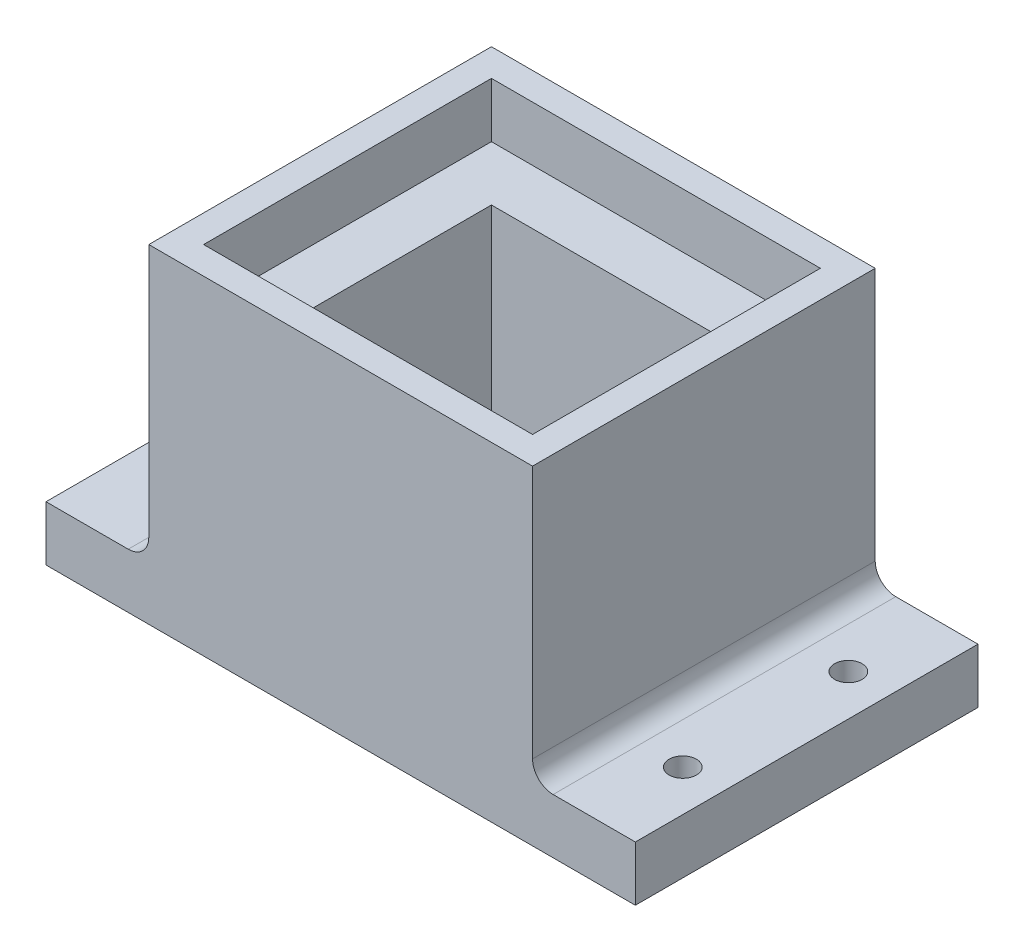
ISO-10303-21;
HEADER;
FILE_DESCRIPTION(('STEP AP214'),'2;1');
FILE_NAME('part.step','',(''),(''),'','','');
FILE_SCHEMA(('AUTOMOTIVE_DESIGN { 1 0 10303 214 1 1 1 1 }'));
ENDSEC;
DATA;
#1=APPLICATION_CONTEXT('core data for automotive mechanical design processes');
#2=APPLICATION_PROTOCOL_DEFINITION('international standard','automotive_design',2000,#1);
#3=PRODUCT_CONTEXT('',#1,'mechanical');
#4=PRODUCT('Part','Part','',(#3));
#5=PRODUCT_RELATED_PRODUCT_CATEGORY('part','',(#4));
#6=PRODUCT_DEFINITION_FORMATION('','',#4);
#7=PRODUCT_DEFINITION_CONTEXT('part definition',#1,'design');
#8=PRODUCT_DEFINITION('design','',#6,#7);
#9=PRODUCT_DEFINITION_SHAPE('','',#8);
#10=(LENGTH_UNIT() NAMED_UNIT(*) SI_UNIT(.MILLI.,.METRE.));
#11=(NAMED_UNIT(*) PLANE_ANGLE_UNIT() SI_UNIT($,.RADIAN.));
#12=(NAMED_UNIT(*) SI_UNIT($,.STERADIAN.) SOLID_ANGLE_UNIT());
#13=UNCERTAINTY_MEASURE_WITH_UNIT(LENGTH_MEASURE(1.E-05),#10,'distance_accuracy_value','');
#14=(GEOMETRIC_REPRESENTATION_CONTEXT(3) GLOBAL_UNCERTAINTY_ASSIGNED_CONTEXT((#13)) GLOBAL_UNIT_ASSIGNED_CONTEXT((#10,
#11,#12)) REPRESENTATION_CONTEXT('',''));
#15=CARTESIAN_POINT('',(0.,0.,0.));
#16=DIRECTION('',(0.,0.,1.));
#17=DIRECTION('',(1.,0.,0.));
#18=AXIS2_PLACEMENT_3D('',#15,#16,#17);
#19=CARTESIAN_POINT('',(28.,48.,25.));
#20=DIRECTION('',(-1.,0.,0.));
#21=DIRECTION('',(0.,0.,1.));
#22=AXIS2_PLACEMENT_3D('',#19,#20,#21);
#23=PLANE('',#22);
#24=DIRECTION('',(0.,-1.,0.));
#25=VECTOR('',#24,1.);
#26=CARTESIAN_POINT('',(28.,48.,25.));
#27=LINE('',#26,#25);
#28=CARTESIAN_POINT('',(28.,48.,25.));
#29=VERTEX_POINT('',#28);
#30=CARTESIAN_POINT('',(28.,11.,25.));
#31=VERTEX_POINT('',#30);
#32=EDGE_CURVE('E312',#29,#31,#27,.T.);
#33=ORIENTED_EDGE('',*,*,#32,.T.);
#34=DIRECTION('',(0.,0.,1.));
#35=VECTOR('',#34,1.);
#36=CARTESIAN_POINT('',(28.,11.,25.));
#37=LINE('',#36,#35);
#38=CARTESIAN_POINT('',(28.,11.,-25.));
#39=VERTEX_POINT('',#38);
#40=EDGE_CURVE('E336',#31,#39,#37,.F.);
#41=ORIENTED_EDGE('',*,*,#40,.T.);
#42=DIRECTION('',(0.,-1.,0.));
#43=VECTOR('',#42,1.);
#44=CARTESIAN_POINT('',(28.,48.,-25.));
#45=LINE('',#44,#43);
#46=CARTESIAN_POINT('',(28.,48.,-25.));
#47=VERTEX_POINT('',#46);
#48=EDGE_CURVE('E328',#47,#39,#45,.T.);
#49=ORIENTED_EDGE('',*,*,#48,.F.);
#50=DIRECTION('',(0.,0.,-1.));
#51=VECTOR('',#50,1.);
#52=CARTESIAN_POINT('',(28.,48.,25.));
#53=LINE('',#52,#51);
#54=EDGE_CURVE('E298',#29,#47,#53,.T.);
#55=ORIENTED_EDGE('',*,*,#54,.F.);
#56=EDGE_LOOP('',(#33,#41,#49,#55));
#57=FACE_BOUND('',#56,.T.);
#58=ADVANCED_FACE('F42',(#57),#23,.F.);
#59=CARTESIAN_POINT('',(-28.,48.,-25.));
#60=DIRECTION('',(0.,0.,1.));
#61=DIRECTION('',(1.,0.,0.));
#62=AXIS2_PLACEMENT_3D('',#59,#60,#61);
#63=PLANE('',#62);
#64=DIRECTION('',(-1.,0.,0.));
#65=VECTOR('',#64,1.);
#66=CARTESIAN_POINT('',(-28.,0.,-25.));
#67=LINE('',#66,#65);
#68=CARTESIAN_POINT('',(43.,0.,-25.));
#69=VERTEX_POINT('',#68);
#70=CARTESIAN_POINT('',(-43.,0.,-25.));
#71=VERTEX_POINT('',#70);
#72=EDGE_CURVE('E288',#69,#71,#67,.T.);
#73=ORIENTED_EDGE('',*,*,#72,.T.);
#74=DIRECTION('',(0.,1.,0.));
#75=VECTOR('',#74,1.);
#76=CARTESIAN_POINT('',(-43.,0.,-25.));
#77=LINE('',#76,#75);
#78=CARTESIAN_POINT('',(-43.,8.,-25.));
#79=VERTEX_POINT('',#78);
#80=EDGE_CURVE('E232',#71,#79,#77,.T.);
#81=ORIENTED_EDGE('',*,*,#80,.T.);
#82=DIRECTION('',(1.,0.,0.));
#83=VECTOR('',#82,1.);
#84=CARTESIAN_POINT('',(-28.,8.,-25.));
#85=LINE('',#84,#83);
#86=CARTESIAN_POINT('',(-31.,8.,-25.));
#87=VERTEX_POINT('',#86);
#88=EDGE_CURVE('E235',#79,#87,#85,.T.);
#89=ORIENTED_EDGE('',*,*,#88,.T.);
#90=CARTESIAN_POINT('',(-31.,11.,-25.));
#91=DIRECTION('',(0.,0.,1.));
#92=DIRECTION('',(1.,0.,0.));
#93=AXIS2_PLACEMENT_3D('',#90,#91,#92);
#94=CIRCLE('',#93,3.);
#95=CARTESIAN_POINT('',(-28.,11.,-25.));
#96=VERTEX_POINT('',#95);
#97=EDGE_CURVE('E355',#87,#96,#94,.T.);
#98=ORIENTED_EDGE('',*,*,#97,.T.);
#99=DIRECTION('',(0.,-1.,0.));
#100=VECTOR('',#99,1.);
#101=CARTESIAN_POINT('',(-28.,48.,-25.));
#102=LINE('',#101,#100);
#103=CARTESIAN_POINT('',(-28.,48.,-25.));
#104=VERTEX_POINT('',#103);
#105=EDGE_CURVE('E324',#104,#96,#102,.T.);
#106=ORIENTED_EDGE('',*,*,#105,.F.);
#107=DIRECTION('',(-1.,0.,0.));
#108=VECTOR('',#107,1.);
#109=CARTESIAN_POINT('',(-28.,48.,-25.));
#110=LINE('',#109,#108);
#111=EDGE_CURVE('E302',#47,#104,#110,.T.);
#112=ORIENTED_EDGE('',*,*,#111,.F.);
#113=ORIENTED_EDGE('',*,*,#48,.T.);
#114=CARTESIAN_POINT('',(31.,11.,-25.));
#115=DIRECTION('',(0.,0.,1.));
#116=DIRECTION('',(1.,0.,0.));
#117=AXIS2_PLACEMENT_3D('',#114,#115,#116);
#118=CIRCLE('',#117,3.);
#119=CARTESIAN_POINT('',(31.,8.00000000000001,-25.));
#120=VERTEX_POINT('',#119);
#121=EDGE_CURVE('E349',#39,#120,#118,.T.);
#122=ORIENTED_EDGE('',*,*,#121,.T.);
#123=DIRECTION('',(1.,0.,0.));
#124=VECTOR('',#123,1.);
#125=CARTESIAN_POINT('',(28.,8.00000000000001,-25.));
#126=LINE('',#125,#124);
#127=CARTESIAN_POINT('',(43.,8.00000000000001,-25.));
#128=VERTEX_POINT('',#127);
#129=EDGE_CURVE('E203',#120,#128,#126,.T.);
#130=ORIENTED_EDGE('',*,*,#129,.T.);
#131=DIRECTION('',(0.,-1.,0.));
#132=VECTOR('',#131,1.);
#133=CARTESIAN_POINT('',(43.,0.,-25.));
#134=LINE('',#133,#132);
#135=EDGE_CURVE('E218',#128,#69,#134,.T.);
#136=ORIENTED_EDGE('',*,*,#135,.T.);
#137=EDGE_LOOP('',(#73,#81,#89,#98,#106,#112,#113,#122,#130,#136));
#138=FACE_BOUND('',#137,.T.);
#139=ADVANCED_FACE('F382',(#138),#63,.F.);
#140=CARTESIAN_POINT('',(-28.,48.,25.));
#141=DIRECTION('',(1.,0.,0.));
#142=DIRECTION('',(0.,0.,-1.));
#143=AXIS2_PLACEMENT_3D('',#140,#141,#142);
#144=PLANE('',#143);
#145=ORIENTED_EDGE('',*,*,#105,.T.);
#146=DIRECTION('',(0.,0.,1.));
#147=VECTOR('',#146,1.);
#148=CARTESIAN_POINT('',(-28.,11.,25.));
#149=LINE('',#148,#147);
#150=CARTESIAN_POINT('',(-28.,11.,25.));
#151=VERTEX_POINT('',#150);
#152=EDGE_CURVE('E339',#96,#151,#149,.T.);
#153=ORIENTED_EDGE('',*,*,#152,.T.);
#154=DIRECTION('',(0.,-1.,0.));
#155=VECTOR('',#154,1.);
#156=CARTESIAN_POINT('',(-28.,48.,25.));
#157=LINE('',#156,#155);
#158=CARTESIAN_POINT('',(-28.,48.,25.));
#159=VERTEX_POINT('',#158);
#160=EDGE_CURVE('E320',#159,#151,#157,.T.);
#161=ORIENTED_EDGE('',*,*,#160,.F.);
#162=DIRECTION('',(0.,0.,1.));
#163=VECTOR('',#162,1.);
#164=CARTESIAN_POINT('',(-28.,48.,25.));
#165=LINE('',#164,#163);
#166=EDGE_CURVE('E306',#104,#159,#165,.T.);
#167=ORIENTED_EDGE('',*,*,#166,.F.);
#168=EDGE_LOOP('',(#145,#153,#161,#167));
#169=FACE_BOUND('',#168,.T.);
#170=ADVANCED_FACE('F388',(#169),#144,.F.);
#171=CARTESIAN_POINT('',(-28.,48.,25.));
#172=DIRECTION('',(0.,0.,-1.));
#173=DIRECTION('',(-1.,0.,0.));
#174=AXIS2_PLACEMENT_3D('',#171,#172,#173);
#175=PLANE('',#174);
#176=DIRECTION('',(1.,0.,0.));
#177=VECTOR('',#176,1.);
#178=CARTESIAN_POINT('',(-28.,0.,25.));
#179=LINE('',#178,#177);
#180=CARTESIAN_POINT('',(-43.,0.,25.));
#181=VERTEX_POINT('',#180);
#182=CARTESIAN_POINT('',(43.,0.,25.));
#183=VERTEX_POINT('',#182);
#184=EDGE_CURVE('E303',#181,#183,#179,.T.);
#185=ORIENTED_EDGE('',*,*,#184,.T.);
#186=DIRECTION('',(0.,1.,0.));
#187=VECTOR('',#186,1.);
#188=CARTESIAN_POINT('',(43.,0.,25.));
#189=LINE('',#188,#187);
#190=CARTESIAN_POINT('',(43.,8.00000000000001,25.));
#191=VERTEX_POINT('',#190);
#192=EDGE_CURVE('E222',#183,#191,#189,.T.);
#193=ORIENTED_EDGE('',*,*,#192,.T.);
#194=DIRECTION('',(-1.,0.,0.));
#195=VECTOR('',#194,1.);
#196=CARTESIAN_POINT('',(28.,8.00000000000001,25.));
#197=LINE('',#196,#195);
#198=CARTESIAN_POINT('',(31.,8.00000000000001,25.));
#199=VERTEX_POINT('',#198);
#200=EDGE_CURVE('E214',#191,#199,#197,.T.);
#201=ORIENTED_EDGE('',*,*,#200,.T.);
#202=CARTESIAN_POINT('',(31.,11.,25.));
#203=DIRECTION('',(0.,0.,-1.));
#204=DIRECTION('',(-1.,0.,0.));
#205=AXIS2_PLACEMENT_3D('',#202,#203,#204);
#206=CIRCLE('',#205,3.);
#207=EDGE_CURVE('E346',#199,#31,#206,.T.);
#208=ORIENTED_EDGE('',*,*,#207,.T.);
#209=ORIENTED_EDGE('',*,*,#32,.F.);
#210=DIRECTION('',(1.,0.,0.));
#211=VECTOR('',#210,1.);
#212=CARTESIAN_POINT('',(-28.,48.,25.));
#213=LINE('',#212,#211);
#214=EDGE_CURVE('E309',#159,#29,#213,.T.);
#215=ORIENTED_EDGE('',*,*,#214,.F.);
#216=ORIENTED_EDGE('',*,*,#160,.T.);
#217=CARTESIAN_POINT('',(-31.,11.,25.));
#218=DIRECTION('',(0.,0.,-1.));
#219=DIRECTION('',(-1.,0.,0.));
#220=AXIS2_PLACEMENT_3D('',#217,#218,#219);
#221=CIRCLE('',#220,3.);
#222=CARTESIAN_POINT('',(-31.,8.,25.));
#223=VERTEX_POINT('',#222);
#224=EDGE_CURVE('E352',#151,#223,#221,.T.);
#225=ORIENTED_EDGE('',*,*,#224,.T.);
#226=DIRECTION('',(-1.,0.,0.));
#227=VECTOR('',#226,1.);
#228=CARTESIAN_POINT('',(-28.,8.,25.));
#229=LINE('',#228,#227);
#230=CARTESIAN_POINT('',(-43.,8.,25.));
#231=VERTEX_POINT('',#230);
#232=EDGE_CURVE('E226',#223,#231,#229,.T.);
#233=ORIENTED_EDGE('',*,*,#232,.T.);
#234=DIRECTION('',(0.,-1.,0.));
#235=VECTOR('',#234,1.);
#236=CARTESIAN_POINT('',(-43.,0.,25.));
#237=LINE('',#236,#235);
#238=EDGE_CURVE('E239',#231,#181,#237,.T.);
#239=ORIENTED_EDGE('',*,*,#238,.T.);
#240=EDGE_LOOP('',(#185,#193,#201,#208,#209,#215,#216,#225,#233,#239));
#241=FACE_BOUND('',#240,.T.);
#242=ADVANCED_FACE('F416',(#241),#175,.F.);
#243=CARTESIAN_POINT('',(0.,48.,0.));
#244=DIRECTION('',(0.,-1.,0.));
#245=DIRECTION('',(0.,0.,-1.));
#246=AXIS2_PLACEMENT_3D('',#243,#244,#245);
#247=PLANE('',#246);
#248=DIRECTION('',(-1.,0.,0.));
#249=VECTOR('',#248,1.);
#250=CARTESIAN_POINT('',(-24.,48.,-21.));
#251=LINE('',#250,#249);
#252=CARTESIAN_POINT('',(24.,48.,-21.));
#253=VERTEX_POINT('',#252);
#254=CARTESIAN_POINT('',(-24.,48.,-21.));
#255=VERTEX_POINT('',#254);
#256=EDGE_CURVE('E274',#253,#255,#251,.T.);
#257=ORIENTED_EDGE('',*,*,#256,.F.);
#258=DIRECTION('',(0.,0.,-1.));
#259=VECTOR('',#258,1.);
#260=CARTESIAN_POINT('',(24.,48.,21.));
#261=LINE('',#260,#259);
#262=CARTESIAN_POINT('',(24.,48.,21.));
#263=VERTEX_POINT('',#262);
#264=EDGE_CURVE('E253',#263,#253,#261,.T.);
#265=ORIENTED_EDGE('',*,*,#264,.F.);
#266=DIRECTION('',(1.,0.,0.));
#267=VECTOR('',#266,1.);
#268=CARTESIAN_POINT('',(-24.,48.,21.));
#269=LINE('',#268,#267);
#270=CARTESIAN_POINT('',(-24.,48.,21.));
#271=VERTEX_POINT('',#270);
#272=EDGE_CURVE('E259',#271,#263,#269,.T.);
#273=ORIENTED_EDGE('',*,*,#272,.F.);
#274=DIRECTION('',(0.,0.,1.));
#275=VECTOR('',#274,1.);
#276=CARTESIAN_POINT('',(-24.,48.,21.));
#277=LINE('',#276,#275);
#278=EDGE_CURVE('E278',#255,#271,#277,.T.);
#279=ORIENTED_EDGE('',*,*,#278,.F.);
#280=EDGE_LOOP('',(#257,#265,#273,#279));
#281=FACE_BOUND('',#280,.T.);
#282=ORIENTED_EDGE('',*,*,#54,.T.);
#283=ORIENTED_EDGE('',*,*,#111,.T.);
#284=ORIENTED_EDGE('',*,*,#166,.T.);
#285=ORIENTED_EDGE('',*,*,#214,.T.);
#286=EDGE_LOOP('',(#282,#283,#284,#285));
#287=FACE_BOUND('',#286,.T.);
#288=ADVANCED_FACE('F438',(#281,#287),#247,.F.);
#289=CARTESIAN_POINT('',(0.,0.,0.));
#290=DIRECTION('',(0.,-1.,0.));
#291=DIRECTION('',(0.,0.,-1.));
#292=AXIS2_PLACEMENT_3D('',#289,#290,#291);
#293=PLANE('',#292);
#294=CARTESIAN_POINT('',(37.,0.,-12.0793859622358));
#295=DIRECTION('',(0.,1.,0.));
#296=DIRECTION('',(1.,0.,0.));
#297=AXIS2_PLACEMENT_3D('',#294,#295,#296);
#298=CIRCLE('',#297,2.);
#299=CARTESIAN_POINT('',(39.,0.,-12.0793859622358));
#300=VERTEX_POINT('',#299);
#301=EDGE_CURVE('E737',#300,#300,#298,.T.);
#302=ORIENTED_EDGE('',*,*,#301,.T.);
#303=EDGE_LOOP('',(#302));
#304=FACE_BOUND('',#303,.T.);
#305=CARTESIAN_POINT('',(37.,0.,12.0793859622358));
#306=DIRECTION('',(0.,1.,0.));
#307=DIRECTION('',(1.,0.,0.));
#308=AXIS2_PLACEMENT_3D('',#305,#306,#307);
#309=CIRCLE('',#308,2.);
#310=CARTESIAN_POINT('',(39.,0.,12.0793859622358));
#311=VERTEX_POINT('',#310);
#312=EDGE_CURVE('E729',#311,#311,#309,.T.);
#313=ORIENTED_EDGE('',*,*,#312,.T.);
#314=EDGE_LOOP('',(#313));
#315=FACE_BOUND('',#314,.T.);
#316=CARTESIAN_POINT('',(-37.,0.,12.0793859622358));
#317=DIRECTION('',(0.,1.,0.));
#318=DIRECTION('',(-1.,0.,0.));
#319=AXIS2_PLACEMENT_3D('',#316,#317,#318);
#320=CIRCLE('',#319,2.);
#321=CARTESIAN_POINT('',(-39.,0.,12.0793859622358));
#322=VERTEX_POINT('',#321);
#323=EDGE_CURVE('E714',#322,#322,#320,.T.);
#324=ORIENTED_EDGE('',*,*,#323,.T.);
#325=EDGE_LOOP('',(#324));
#326=FACE_BOUND('',#325,.T.);
#327=CARTESIAN_POINT('',(-37.,0.,-12.0793859622358));
#328=DIRECTION('',(0.,1.,0.));
#329=DIRECTION('',(-1.,0.,0.));
#330=AXIS2_PLACEMENT_3D('',#327,#328,#329);
#331=CIRCLE('',#330,2.);
#332=CARTESIAN_POINT('',(-39.,0.,-12.0793859622358));
#333=VERTEX_POINT('',#332);
#334=EDGE_CURVE('E188',#333,#333,#331,.T.);
#335=ORIENTED_EDGE('',*,*,#334,.T.);
#336=EDGE_LOOP('',(#335));
#337=FACE_BOUND('',#336,.T.);
#338=DIRECTION('',(0.,0.,-1.));
#339=VECTOR('',#338,1.);
#340=CARTESIAN_POINT('',(16.,0.,13.));
#341=LINE('',#340,#339);
#342=CARTESIAN_POINT('',(16.,0.,13.));
#343=VERTEX_POINT('',#342);
#344=CARTESIAN_POINT('',(16.,0.,-13.));
#345=VERTEX_POINT('',#344);
#346=EDGE_CURVE('E171',#343,#345,#341,.T.);
#347=ORIENTED_EDGE('',*,*,#346,.T.);
#348=DIRECTION('',(-1.,0.,0.));
#349=VECTOR('',#348,1.);
#350=CARTESIAN_POINT('',(-16.,0.,-13.));
#351=LINE('',#350,#349);
#352=CARTESIAN_POINT('',(-16.,0.,-13.));
#353=VERTEX_POINT('',#352);
#354=EDGE_CURVE('E179',#345,#353,#351,.T.);
#355=ORIENTED_EDGE('',*,*,#354,.T.);
#356=DIRECTION('',(0.,0.,1.));
#357=VECTOR('',#356,1.);
#358=CARTESIAN_POINT('',(-16.,0.,13.));
#359=LINE('',#358,#357);
#360=CARTESIAN_POINT('',(-16.,0.,13.));
#361=VERTEX_POINT('',#360);
#362=EDGE_CURVE('E58',#353,#361,#359,.T.);
#363=ORIENTED_EDGE('',*,*,#362,.T.);
#364=DIRECTION('',(1.,0.,0.));
#365=VECTOR('',#364,1.);
#366=CARTESIAN_POINT('',(-16.,0.,13.));
#367=LINE('',#366,#365);
#368=EDGE_CURVE('E176',#361,#343,#367,.T.);
#369=ORIENTED_EDGE('',*,*,#368,.T.);
#370=EDGE_LOOP('',(#347,#355,#363,#369));
#371=FACE_BOUND('',#370,.T.);
#372=ORIENTED_EDGE('',*,*,#72,.F.);
#373=DIRECTION('',(0.,0.,1.));
#374=VECTOR('',#373,1.);
#375=CARTESIAN_POINT('',(43.,0.,-42.));
#376=LINE('',#375,#374);
#377=EDGE_CURVE('E210',#69,#183,#376,.T.);
#378=ORIENTED_EDGE('',*,*,#377,.T.);
#379=ORIENTED_EDGE('',*,*,#184,.F.);
#380=DIRECTION('',(0.,0.,1.));
#381=VECTOR('',#380,1.);
#382=CARTESIAN_POINT('',(-43.,0.,-42.));
#383=LINE('',#382,#381);
#384=EDGE_CURVE('E236',#71,#181,#383,.T.);
#385=ORIENTED_EDGE('',*,*,#384,.F.);
#386=EDGE_LOOP('',(#372,#378,#379,#385));
#387=FACE_BOUND('',#386,.T.);
#388=ADVANCED_FACE('F184',(#304,#315,#326,#337,#371,#387),#293,.T.);
#389=CARTESIAN_POINT('',(24.,40.,21.));
#390=DIRECTION('',(1.,0.,0.));
#391=DIRECTION('',(0.,0.,-1.));
#392=AXIS2_PLACEMENT_3D('',#389,#390,#391);
#393=PLANE('',#392);
#394=ORIENTED_EDGE('',*,*,#264,.T.);
#395=DIRECTION('',(0.,1.,0.));
#396=VECTOR('',#395,1.);
#397=CARTESIAN_POINT('',(24.,40.,-21.));
#398=LINE('',#397,#396);
#399=CARTESIAN_POINT('',(24.,40.,-21.));
#400=VERTEX_POINT('',#399);
#401=EDGE_CURVE('E271',#400,#253,#398,.T.);
#402=ORIENTED_EDGE('',*,*,#401,.F.);
#403=DIRECTION('',(0.,0.,-1.));
#404=VECTOR('',#403,1.);
#405=CARTESIAN_POINT('',(24.,40.,21.));
#406=LINE('',#405,#404);
#407=CARTESIAN_POINT('',(24.,40.,21.));
#408=VERTEX_POINT('',#407);
#409=EDGE_CURVE('E254',#408,#400,#406,.T.);
#410=ORIENTED_EDGE('',*,*,#409,.F.);
#411=DIRECTION('',(0.,1.,0.));
#412=VECTOR('',#411,1.);
#413=CARTESIAN_POINT('',(24.,40.,21.));
#414=LINE('',#413,#412);
#415=EDGE_CURVE('E285',#408,#263,#414,.T.);
#416=ORIENTED_EDGE('',*,*,#415,.T.);
#417=EDGE_LOOP('',(#394,#402,#410,#416));
#418=FACE_BOUND('',#417,.T.);
#419=ADVANCED_FACE('F447',(#418),#393,.F.);
#420=CARTESIAN_POINT('',(-24.,40.,21.));
#421=DIRECTION('',(0.,0.,1.));
#422=DIRECTION('',(1.,0.,0.));
#423=AXIS2_PLACEMENT_3D('',#420,#421,#422);
#424=PLANE('',#423);
#425=ORIENTED_EDGE('',*,*,#272,.T.);
#426=ORIENTED_EDGE('',*,*,#415,.F.);
#427=DIRECTION('',(1.,0.,0.));
#428=VECTOR('',#427,1.);
#429=CARTESIAN_POINT('',(-24.,40.,21.));
#430=LINE('',#429,#428);
#431=CARTESIAN_POINT('',(-24.,40.,21.));
#432=VERTEX_POINT('',#431);
#433=EDGE_CURVE('E267',#432,#408,#430,.T.);
#434=ORIENTED_EDGE('',*,*,#433,.F.);
#435=DIRECTION('',(0.,1.,0.));
#436=VECTOR('',#435,1.);
#437=CARTESIAN_POINT('',(-24.,40.,21.));
#438=LINE('',#437,#436);
#439=EDGE_CURVE('E289',#432,#271,#438,.T.);
#440=ORIENTED_EDGE('',*,*,#439,.T.);
#441=EDGE_LOOP('',(#425,#426,#434,#440));
#442=FACE_BOUND('',#441,.T.);
#443=ADVANCED_FACE('F634',(#442),#424,.F.);
#444=CARTESIAN_POINT('',(-24.,40.,21.));
#445=DIRECTION('',(-1.,0.,0.));
#446=DIRECTION('',(0.,0.,1.));
#447=AXIS2_PLACEMENT_3D('',#444,#445,#446);
#448=PLANE('',#447);
#449=ORIENTED_EDGE('',*,*,#278,.T.);
#450=ORIENTED_EDGE('',*,*,#439,.F.);
#451=DIRECTION('',(0.,0.,1.));
#452=VECTOR('',#451,1.);
#453=CARTESIAN_POINT('',(-24.,40.,21.));
#454=LINE('',#453,#452);
#455=CARTESIAN_POINT('',(-24.,40.,-21.));
#456=VERTEX_POINT('',#455);
#457=EDGE_CURVE('E263',#456,#432,#454,.T.);
#458=ORIENTED_EDGE('',*,*,#457,.F.);
#459=DIRECTION('',(0.,1.,0.));
#460=VECTOR('',#459,1.);
#461=CARTESIAN_POINT('',(-24.,40.,-21.));
#462=LINE('',#461,#460);
#463=EDGE_CURVE('E292',#456,#255,#462,.T.);
#464=ORIENTED_EDGE('',*,*,#463,.T.);
#465=EDGE_LOOP('',(#449,#450,#458,#464));
#466=FACE_BOUND('',#465,.T.);
#467=ADVANCED_FACE('F625',(#466),#448,.F.);
#468=CARTESIAN_POINT('',(-24.,40.,-21.));
#469=DIRECTION('',(0.,0.,-1.));
#470=DIRECTION('',(-1.,0.,0.));
#471=AXIS2_PLACEMENT_3D('',#468,#469,#470);
#472=PLANE('',#471);
#473=ORIENTED_EDGE('',*,*,#256,.T.);
#474=ORIENTED_EDGE('',*,*,#463,.F.);
#475=DIRECTION('',(-1.,0.,0.));
#476=VECTOR('',#475,1.);
#477=CARTESIAN_POINT('',(-24.,40.,-21.));
#478=LINE('',#477,#476);
#479=EDGE_CURVE('E258',#400,#456,#478,.T.);
#480=ORIENTED_EDGE('',*,*,#479,.F.);
#481=ORIENTED_EDGE('',*,*,#401,.T.);
#482=EDGE_LOOP('',(#473,#474,#480,#481));
#483=FACE_BOUND('',#482,.T.);
#484=ADVANCED_FACE('F489',(#483),#472,.F.);
#485=CARTESIAN_POINT('',(0.,40.,0.));
#486=DIRECTION('',(0.,-1.,0.));
#487=DIRECTION('',(0.,0.,-1.));
#488=AXIS2_PLACEMENT_3D('',#485,#486,#487);
#489=PLANE('',#488);
#490=DIRECTION('',(1.,0.,0.));
#491=VECTOR('',#490,1.);
#492=CARTESIAN_POINT('',(0.,40.,-13.));
#493=LINE('',#492,#491);
#494=CARTESIAN_POINT('',(-16.,40.,-13.));
#495=VERTEX_POINT('',#494);
#496=CARTESIAN_POINT('',(16.,40.,-13.));
#497=VERTEX_POINT('',#496);
#498=EDGE_CURVE('E358',#495,#497,#493,.T.);
#499=ORIENTED_EDGE('',*,*,#498,.T.);
#500=DIRECTION('',(0.,0.,1.));
#501=VECTOR('',#500,1.);
#502=CARTESIAN_POINT('',(16.,40.,0.));
#503=LINE('',#502,#501);
#504=CARTESIAN_POINT('',(16.,40.,13.));
#505=VERTEX_POINT('',#504);
#506=EDGE_CURVE('E11',#497,#505,#503,.T.);
#507=ORIENTED_EDGE('',*,*,#506,.T.);
#508=DIRECTION('',(-1.,0.,0.));
#509=VECTOR('',#508,1.);
#510=CARTESIAN_POINT('',(0.,40.,13.));
#511=LINE('',#510,#509);
#512=CARTESIAN_POINT('',(-16.,40.,13.));
#513=VERTEX_POINT('',#512);
#514=EDGE_CURVE('E51',#505,#513,#511,.T.);
#515=ORIENTED_EDGE('',*,*,#514,.T.);
#516=DIRECTION('',(0.,0.,-1.));
#517=VECTOR('',#516,1.);
#518=CARTESIAN_POINT('',(-16.,40.,0.));
#519=LINE('',#518,#517);
#520=EDGE_CURVE('E361',#513,#495,#519,.T.);
#521=ORIENTED_EDGE('',*,*,#520,.T.);
#522=EDGE_LOOP('',(#499,#507,#515,#521));
#523=FACE_BOUND('',#522,.T.);
#524=ORIENTED_EDGE('',*,*,#409,.T.);
#525=ORIENTED_EDGE('',*,*,#479,.T.);
#526=ORIENTED_EDGE('',*,*,#457,.T.);
#527=ORIENTED_EDGE('',*,*,#433,.T.);
#528=EDGE_LOOP('',(#524,#525,#526,#527));
#529=FACE_BOUND('',#528,.T.);
#530=ADVANCED_FACE('F367',(#523,#529),#489,.F.);
#531=CARTESIAN_POINT('',(-43.,0.,-42.));
#532=DIRECTION('',(-1.,0.,0.));
#533=DIRECTION('',(0.,0.,1.));
#534=AXIS2_PLACEMENT_3D('',#531,#532,#533);
#535=PLANE('',#534);
#536=ORIENTED_EDGE('',*,*,#80,.F.);
#537=ORIENTED_EDGE('',*,*,#384,.T.);
#538=ORIENTED_EDGE('',*,*,#238,.F.);
#539=DIRECTION('',(0.,0.,1.));
#540=VECTOR('',#539,1.);
#541=CARTESIAN_POINT('',(-43.,8.,-42.));
#542=LINE('',#541,#540);
#543=EDGE_CURVE('E243',#79,#231,#542,.T.);
#544=ORIENTED_EDGE('',*,*,#543,.F.);
#545=EDGE_LOOP('',(#536,#537,#538,#544));
#546=FACE_BOUND('',#545,.T.);
#547=ADVANCED_FACE('F422',(#546),#535,.T.);
#548=CARTESIAN_POINT('',(-28.,8.,-42.));
#549=DIRECTION('',(0.,1.,0.));
#550=DIRECTION('',(-1.,0.,0.));
#551=AXIS2_PLACEMENT_3D('',#548,#549,#550);
#552=PLANE('',#551);
#553=CARTESIAN_POINT('',(-37.,8.,12.0793859622358));
#554=DIRECTION('',(0.,1.,0.));
#555=DIRECTION('',(-1.,0.,0.));
#556=AXIS2_PLACEMENT_3D('',#553,#554,#555);
#557=CIRCLE('',#556,2.);
#558=CARTESIAN_POINT('',(-39.,8.,12.0793859622358));
#559=VERTEX_POINT('',#558);
#560=EDGE_CURVE('E717',#559,#559,#557,.T.);
#561=ORIENTED_EDGE('',*,*,#560,.F.);
#562=EDGE_LOOP('',(#561));
#563=FACE_BOUND('',#562,.T.);
#564=CARTESIAN_POINT('',(-37.,8.,-12.0793859622358));
#565=DIRECTION('',(0.,1.,0.));
#566=DIRECTION('',(-1.,0.,0.));
#567=AXIS2_PLACEMENT_3D('',#564,#565,#566);
#568=CIRCLE('',#567,2.);
#569=CARTESIAN_POINT('',(-39.,8.,-12.0793859622358));
#570=VERTEX_POINT('',#569);
#571=EDGE_CURVE('E192',#570,#570,#568,.T.);
#572=ORIENTED_EDGE('',*,*,#571,.F.);
#573=EDGE_LOOP('',(#572));
#574=FACE_BOUND('',#573,.T.);
#575=ORIENTED_EDGE('',*,*,#232,.F.);
#576=DIRECTION('',(0.,0.,1.));
#577=VECTOR('',#576,1.);
#578=CARTESIAN_POINT('',(-31.,8.,-42.));
#579=LINE('',#578,#577);
#580=EDGE_CURVE('E343',#223,#87,#579,.F.);
#581=ORIENTED_EDGE('',*,*,#580,.T.);
#582=ORIENTED_EDGE('',*,*,#88,.F.);
#583=ORIENTED_EDGE('',*,*,#543,.T.);
#584=EDGE_LOOP('',(#575,#581,#582,#583));
#585=FACE_BOUND('',#584,.T.);
#586=ADVANCED_FACE('F426',(#563,#574,#585),#552,.T.);
#587=CARTESIAN_POINT('',(28.,8.00000000000001,-42.));
#588=DIRECTION('',(0.,1.,0.));
#589=DIRECTION('',(0.,0.,1.));
#590=AXIS2_PLACEMENT_3D('',#587,#588,#589);
#591=PLANE('',#590);
#592=CARTESIAN_POINT('',(37.,8.00000000000001,-12.0793859622358));
#593=DIRECTION('',(0.,1.,0.));
#594=DIRECTION('',(1.,0.,0.));
#595=AXIS2_PLACEMENT_3D('',#592,#593,#594);
#596=CIRCLE('',#595,2.);
#597=CARTESIAN_POINT('',(39.,8.00000000000001,-12.0793859622358));
#598=VERTEX_POINT('',#597);
#599=EDGE_CURVE('E733',#598,#598,#596,.T.);
#600=ORIENTED_EDGE('',*,*,#599,.F.);
#601=EDGE_LOOP('',(#600));
#602=FACE_BOUND('',#601,.T.);
#603=CARTESIAN_POINT('',(37.,8.00000000000001,12.0793859622358));
#604=DIRECTION('',(0.,1.,0.));
#605=DIRECTION('',(1.,0.,0.));
#606=AXIS2_PLACEMENT_3D('',#603,#604,#605);
#607=CIRCLE('',#606,2.);
#608=CARTESIAN_POINT('',(39.,8.00000000000001,12.0793859622358));
#609=VERTEX_POINT('',#608);
#610=EDGE_CURVE('E723',#609,#609,#607,.T.);
#611=ORIENTED_EDGE('',*,*,#610,.F.);
#612=EDGE_LOOP('',(#611));
#613=FACE_BOUND('',#612,.T.);
#614=ORIENTED_EDGE('',*,*,#129,.F.);
#615=DIRECTION('',(0.,0.,1.));
#616=VECTOR('',#615,1.);
#617=CARTESIAN_POINT('',(31.,8.00000000000001,-42.));
#618=LINE('',#617,#616);
#619=EDGE_CURVE('E332',#120,#199,#618,.T.);
#620=ORIENTED_EDGE('',*,*,#619,.T.);
#621=ORIENTED_EDGE('',*,*,#200,.F.);
#622=DIRECTION('',(0.,0.,1.));
#623=VECTOR('',#622,1.);
#624=CARTESIAN_POINT('',(43.,8.00000000000001,-42.));
#625=LINE('',#624,#623);
#626=EDGE_CURVE('E215',#128,#191,#625,.T.);
#627=ORIENTED_EDGE('',*,*,#626,.F.);
#628=EDGE_LOOP('',(#614,#620,#621,#627));
#629=FACE_BOUND('',#628,.T.);
#630=ADVANCED_FACE('F401',(#602,#613,#629),#591,.T.);
#631=CARTESIAN_POINT('',(43.,0.,-42.));
#632=DIRECTION('',(1.,0.,0.));
#633=DIRECTION('',(0.,0.,-1.));
#634=AXIS2_PLACEMENT_3D('',#631,#632,#633);
#635=PLANE('',#634);
#636=ORIENTED_EDGE('',*,*,#135,.F.);
#637=ORIENTED_EDGE('',*,*,#626,.T.);
#638=ORIENTED_EDGE('',*,*,#192,.F.);
#639=ORIENTED_EDGE('',*,*,#377,.F.);
#640=EDGE_LOOP('',(#636,#637,#638,#639));
#641=FACE_BOUND('',#640,.T.);
#642=ADVANCED_FACE('F394',(#641),#635,.T.);
#643=CARTESIAN_POINT('',(31.,11.,-42.));
#644=DIRECTION('',(0.,0.,1.));
#645=DIRECTION('',(1.,0.,0.));
#646=AXIS2_PLACEMENT_3D('',#643,#644,#645);
#647=CYLINDRICAL_SURFACE('',#646,3.);
#648=ORIENTED_EDGE('',*,*,#121,.F.);
#649=ORIENTED_EDGE('',*,*,#40,.F.);
#650=ORIENTED_EDGE('',*,*,#207,.F.);
#651=ORIENTED_EDGE('',*,*,#619,.F.);
#652=EDGE_LOOP('',(#648,#649,#650,#651));
#653=FACE_BOUND('',#652,.T.);
#654=ADVANCED_FACE('F392',(#653),#647,.F.);
#655=CARTESIAN_POINT('',(-31.,11.,25.));
#656=DIRECTION('',(0.,0.,1.));
#657=DIRECTION('',(1.,0.,0.));
#658=AXIS2_PLACEMENT_3D('',#655,#656,#657);
#659=CYLINDRICAL_SURFACE('',#658,3.);
#660=ORIENTED_EDGE('',*,*,#97,.F.);
#661=ORIENTED_EDGE('',*,*,#580,.F.);
#662=ORIENTED_EDGE('',*,*,#224,.F.);
#663=ORIENTED_EDGE('',*,*,#152,.F.);
#664=EDGE_LOOP('',(#660,#661,#662,#663));
#665=FACE_BOUND('',#664,.T.);
#666=ADVANCED_FACE('F44',(#665),#659,.F.);
#667=CARTESIAN_POINT('',(16.,0.,13.));
#668=DIRECTION('',(1.,0.,0.));
#669=DIRECTION('',(0.,0.,-1.));
#670=AXIS2_PLACEMENT_3D('',#667,#668,#669);
#671=PLANE('',#670);
#672=DIRECTION('',(0.,1.,0.));
#673=VECTOR('',#672,1.);
#674=CARTESIAN_POINT('',(16.,0.,-13.));
#675=LINE('',#674,#673);
#676=EDGE_CURVE('E66',#345,#497,#675,.T.);
#677=ORIENTED_EDGE('',*,*,#676,.F.);
#678=ORIENTED_EDGE('',*,*,#346,.F.);
#679=DIRECTION('',(0.,1.,0.));
#680=VECTOR('',#679,1.);
#681=CARTESIAN_POINT('',(16.,0.,13.));
#682=LINE('',#681,#680);
#683=EDGE_CURVE('E200',#343,#505,#682,.T.);
#684=ORIENTED_EDGE('',*,*,#683,.T.);
#685=ORIENTED_EDGE('',*,*,#506,.F.);
#686=EDGE_LOOP('',(#677,#678,#684,#685));
#687=FACE_BOUND('',#686,.T.);
#688=ADVANCED_FACE('F168',(#687),#671,.F.);
#689=CARTESIAN_POINT('',(-16.,0.,13.));
#690=DIRECTION('',(0.,0.,1.));
#691=DIRECTION('',(1.,0.,0.));
#692=AXIS2_PLACEMENT_3D('',#689,#690,#691);
#693=PLANE('',#692);
#694=ORIENTED_EDGE('',*,*,#683,.F.);
#695=ORIENTED_EDGE('',*,*,#368,.F.);
#696=DIRECTION('',(0.,1.,0.));
#697=VECTOR('',#696,1.);
#698=CARTESIAN_POINT('',(-16.,0.,13.));
#699=LINE('',#698,#697);
#700=EDGE_CURVE('E204',#361,#513,#699,.T.);
#701=ORIENTED_EDGE('',*,*,#700,.T.);
#702=ORIENTED_EDGE('',*,*,#514,.F.);
#703=EDGE_LOOP('',(#694,#695,#701,#702));
#704=FACE_BOUND('',#703,.T.);
#705=ADVANCED_FACE('F370',(#704),#693,.F.);
#706=CARTESIAN_POINT('',(-16.,0.,13.));
#707=DIRECTION('',(-1.,0.,0.));
#708=DIRECTION('',(0.,0.,1.));
#709=AXIS2_PLACEMENT_3D('',#706,#707,#708);
#710=PLANE('',#709);
#711=ORIENTED_EDGE('',*,*,#700,.F.);
#712=ORIENTED_EDGE('',*,*,#362,.F.);
#713=DIRECTION('',(0.,1.,0.));
#714=VECTOR('',#713,1.);
#715=CARTESIAN_POINT('',(-16.,0.,-13.));
#716=LINE('',#715,#714);
#717=EDGE_CURVE('E175',#353,#495,#716,.T.);
#718=ORIENTED_EDGE('',*,*,#717,.T.);
#719=ORIENTED_EDGE('',*,*,#520,.F.);
#720=EDGE_LOOP('',(#711,#712,#718,#719));
#721=FACE_BOUND('',#720,.T.);
#722=ADVANCED_FACE('F371',(#721),#710,.F.);
#723=CARTESIAN_POINT('',(-16.,0.,-13.));
#724=DIRECTION('',(0.,0.,-1.));
#725=DIRECTION('',(-1.,0.,0.));
#726=AXIS2_PLACEMENT_3D('',#723,#724,#725);
#727=PLANE('',#726);
#728=ORIENTED_EDGE('',*,*,#717,.F.);
#729=ORIENTED_EDGE('',*,*,#354,.F.);
#730=ORIENTED_EDGE('',*,*,#676,.T.);
#731=ORIENTED_EDGE('',*,*,#498,.F.);
#732=EDGE_LOOP('',(#728,#729,#730,#731));
#733=FACE_BOUND('',#732,.T.);
#734=ADVANCED_FACE('F180',(#733),#727,.F.);
#735=CARTESIAN_POINT('',(37.,0.,12.0793859622358));
#736=DIRECTION('',(0.,1.,0.));
#737=DIRECTION('',(-1.,0.,0.));
#738=AXIS2_PLACEMENT_3D('',#735,#736,#737);
#739=CYLINDRICAL_SURFACE('',#738,2.);
#740=ORIENTED_EDGE('',*,*,#312,.F.);
#741=EDGE_LOOP('',(#740));
#742=FACE_BOUND('',#741,.T.);
#743=ORIENTED_EDGE('',*,*,#610,.T.);
#744=EDGE_LOOP('',(#743));
#745=FACE_BOUND('',#744,.T.);
#746=ADVANCED_FACE('F378',(#742,#745),#739,.F.);
#747=CARTESIAN_POINT('',(37.,0.,-12.0793859622358));
#748=DIRECTION('',(0.,1.,0.));
#749=DIRECTION('',(-1.,0.,0.));
#750=AXIS2_PLACEMENT_3D('',#747,#748,#749);
#751=CYLINDRICAL_SURFACE('',#750,2.);
#752=ORIENTED_EDGE('',*,*,#301,.F.);
#753=EDGE_LOOP('',(#752));
#754=FACE_BOUND('',#753,.T.);
#755=ORIENTED_EDGE('',*,*,#599,.T.);
#756=EDGE_LOOP('',(#755));
#757=FACE_BOUND('',#756,.T.);
#758=ADVANCED_FACE('F547',(#754,#757),#751,.F.);
#759=CARTESIAN_POINT('',(-37.,0.,-12.0793859622358));
#760=DIRECTION('',(0.,1.,0.));
#761=DIRECTION('',(-1.,0.,0.));
#762=AXIS2_PLACEMENT_3D('',#759,#760,#761);
#763=CYLINDRICAL_SURFACE('',#762,2.);
#764=ORIENTED_EDGE('',*,*,#334,.F.);
#765=EDGE_LOOP('',(#764));
#766=FACE_BOUND('',#765,.T.);
#767=ORIENTED_EDGE('',*,*,#571,.T.);
#768=EDGE_LOOP('',(#767));
#769=FACE_BOUND('',#768,.T.);
#770=ADVANCED_FACE('F558',(#766,#769),#763,.F.);
#771=CARTESIAN_POINT('',(-37.,0.,12.0793859622358));
#772=DIRECTION('',(0.,1.,0.));
#773=DIRECTION('',(-1.,0.,0.));
#774=AXIS2_PLACEMENT_3D('',#771,#772,#773);
#775=CYLINDRICAL_SURFACE('',#774,2.);
#776=ORIENTED_EDGE('',*,*,#323,.F.);
#777=EDGE_LOOP('',(#776));
#778=FACE_BOUND('',#777,.T.);
#779=ORIENTED_EDGE('',*,*,#560,.T.);
#780=EDGE_LOOP('',(#779));
#781=FACE_BOUND('',#780,.T.);
#782=ADVANCED_FACE('F569',(#778,#781),#775,.F.);
#783=CLOSED_SHELL('',(#58,#139,#170,#242,#288,#388,#419,#443,#467,#484,#530,#547,#586,#630,#642,
#654,#666,#688,#705,#722,#734,#746,#758,#770,#782));
#784=MANIFOLD_SOLID_BREP('B2',#783);
#785=ADVANCED_BREP_SHAPE_REPRESENTATION('',(#18,#784),#14);
#786=SHAPE_DEFINITION_REPRESENTATION(#9,#785);
ENDSEC;
END-ISO-10303-21;
